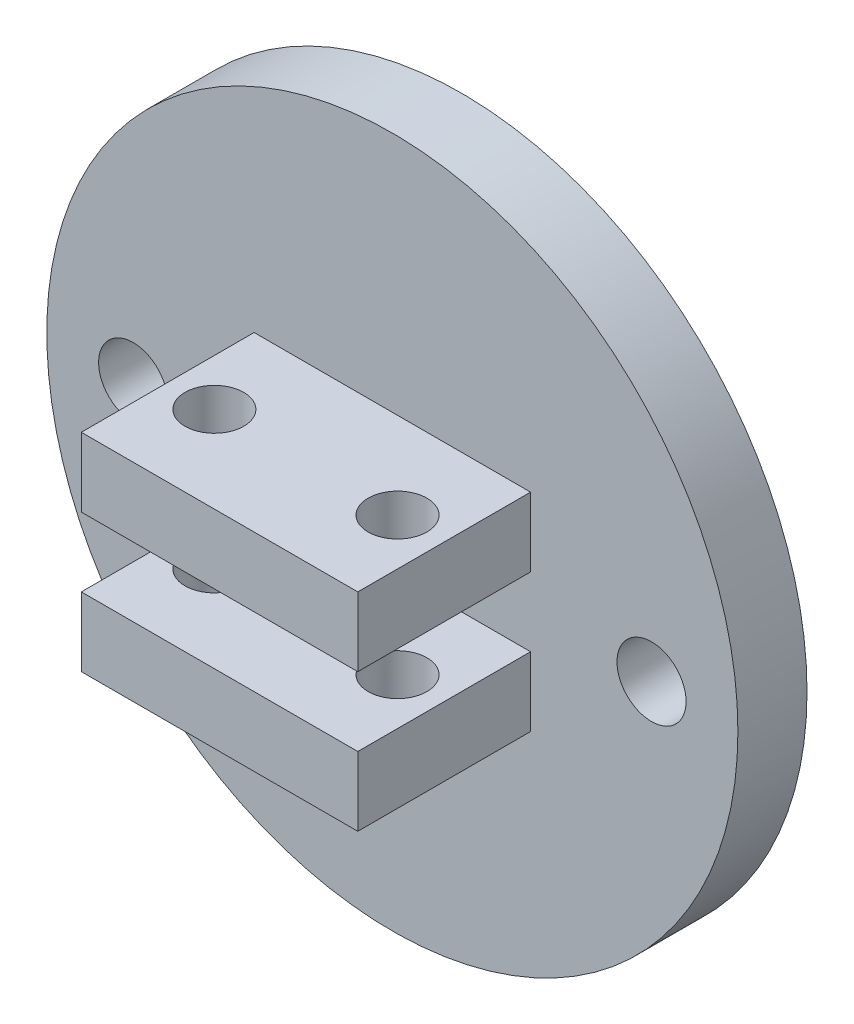
ISO-10303-21;
HEADER;
FILE_DESCRIPTION(('STEP AP214'),'2;1');
FILE_NAME('part.step','',(''),(''),'','','');
FILE_SCHEMA(('AUTOMOTIVE_DESIGN { 1 0 10303 214 1 1 1 1 }'));
ENDSEC;
DATA;
#1=APPLICATION_CONTEXT('core data for automotive mechanical design processes');
#2=APPLICATION_PROTOCOL_DEFINITION('international standard','automotive_design',2000,#1);
#3=PRODUCT_CONTEXT('',#1,'mechanical');
#4=PRODUCT('Part','Part','',(#3));
#5=PRODUCT_RELATED_PRODUCT_CATEGORY('part','',(#4));
#6=PRODUCT_DEFINITION_FORMATION('','',#4);
#7=PRODUCT_DEFINITION_CONTEXT('part definition',#1,'design');
#8=PRODUCT_DEFINITION('design','',#6,#7);
#9=PRODUCT_DEFINITION_SHAPE('','',#8);
#10=(LENGTH_UNIT() NAMED_UNIT(*) SI_UNIT(.MILLI.,.METRE.));
#11=(NAMED_UNIT(*) PLANE_ANGLE_UNIT() SI_UNIT($,.RADIAN.));
#12=(NAMED_UNIT(*) SI_UNIT($,.STERADIAN.) SOLID_ANGLE_UNIT());
#13=UNCERTAINTY_MEASURE_WITH_UNIT(LENGTH_MEASURE(1.E-05),#10,'distance_accuracy_value','');
#14=(GEOMETRIC_REPRESENTATION_CONTEXT(3) GLOBAL_UNCERTAINTY_ASSIGNED_CONTEXT((#13)) GLOBAL_UNIT_ASSIGNED_CONTEXT((#10,
#11,#12)) REPRESENTATION_CONTEXT('',''));
#15=CARTESIAN_POINT('',(0.,0.,0.));
#16=DIRECTION('',(0.,0.,1.));
#17=DIRECTION('',(1.,0.,0.));
#18=AXIS2_PLACEMENT_3D('',#15,#16,#17);
#19=CARTESIAN_POINT('',(0.,0.,2.));
#20=DIRECTION('',(0.,0.,1.));
#21=DIRECTION('',(1.,0.,0.));
#22=AXIS2_PLACEMENT_3D('',#19,#20,#21);
#23=PLANE('',#22);
#24=DIRECTION('',(0.,-1.,0.));
#25=VECTOR('',#24,1.);
#26=CARTESIAN_POINT('',(4.,0.,2.));
#27=LINE('',#26,#25);
#28=CARTESIAN_POINT('',(4.,-1.,2.));
#29=VERTEX_POINT('',#28);
#30=CARTESIAN_POINT('',(4.,-3.,2.));
#31=VERTEX_POINT('',#30);
#32=EDGE_CURVE('E113',#29,#31,#27,.T.);
#33=ORIENTED_EDGE('',*,*,#32,.T.);
#34=DIRECTION('',(1.,0.,0.));
#35=VECTOR('',#34,1.);
#36=CARTESIAN_POINT('',(0.,-3.,2.));
#37=LINE('',#36,#35);
#38=CARTESIAN_POINT('',(-4.,-3.,2.));
#39=VERTEX_POINT('',#38);
#40=EDGE_CURVE('E127',#39,#31,#37,.T.);
#41=ORIENTED_EDGE('',*,*,#40,.F.);
#42=DIRECTION('',(0.,-1.,0.));
#43=VECTOR('',#42,1.);
#44=CARTESIAN_POINT('',(-4.,0.,2.));
#45=LINE('',#44,#43);
#46=CARTESIAN_POINT('',(-4.,-1.,2.));
#47=VERTEX_POINT('',#46);
#48=EDGE_CURVE('E142',#47,#39,#45,.T.);
#49=ORIENTED_EDGE('',*,*,#48,.F.);
#50=DIRECTION('',(1.,0.,0.));
#51=VECTOR('',#50,1.);
#52=CARTESIAN_POINT('',(0.,-1.,2.));
#53=LINE('',#52,#51);
#54=EDGE_CURVE('E139',#47,#29,#53,.T.);
#55=ORIENTED_EDGE('',*,*,#54,.T.);
#56=EDGE_LOOP('',(#33,#41,#49,#55));
#57=FACE_BOUND('',#56,.T.);
#58=CARTESIAN_POINT('',(-7.5,0.,2.));
#59=DIRECTION('',(0.,0.,1.));
#60=DIRECTION('',(1.,0.,0.));
#61=AXIS2_PLACEMENT_3D('',#58,#59,#60);
#62=CIRCLE('',#61,1.);
#63=CARTESIAN_POINT('',(-6.5,0.,2.));
#64=VERTEX_POINT('',#63);
#65=EDGE_CURVE('E184',#64,#64,#62,.T.);
#66=ORIENTED_EDGE('',*,*,#65,.F.);
#67=EDGE_LOOP('',(#66));
#68=FACE_BOUND('',#67,.T.);
#69=CARTESIAN_POINT('',(0.,0.,2.));
#70=DIRECTION('',(0.,0.,1.));
#71=DIRECTION('',(1.,0.,0.));
#72=AXIS2_PLACEMENT_3D('',#69,#70,#71);
#73=CIRCLE('',#72,10.);
#74=CARTESIAN_POINT('',(10.,0.,2.));
#75=VERTEX_POINT('',#74);
#76=EDGE_CURVE('E11',#75,#75,#73,.T.);
#77=ORIENTED_EDGE('',*,*,#76,.T.);
#78=EDGE_LOOP('',(#77));
#79=FACE_BOUND('',#78,.T.);
#80=CARTESIAN_POINT('',(7.5,0.,2.));
#81=DIRECTION('',(0.,0.,1.));
#82=DIRECTION('',(1.,0.,0.));
#83=AXIS2_PLACEMENT_3D('',#80,#81,#82);
#84=CIRCLE('',#83,1.);
#85=CARTESIAN_POINT('',(8.5,0.,2.));
#86=VERTEX_POINT('',#85);
#87=EDGE_CURVE('E178',#86,#86,#84,.T.);
#88=ORIENTED_EDGE('',*,*,#87,.F.);
#89=EDGE_LOOP('',(#88));
#90=FACE_BOUND('',#89,.T.);
#91=DIRECTION('',(0.,1.,0.));
#92=VECTOR('',#91,1.);
#93=CARTESIAN_POINT('',(4.,0.,2.));
#94=LINE('',#93,#92);
#95=CARTESIAN_POINT('',(4.,1.,2.));
#96=VERTEX_POINT('',#95);
#97=CARTESIAN_POINT('',(4.,3.,2.));
#98=VERTEX_POINT('',#97);
#99=EDGE_CURVE('E64',#96,#98,#94,.T.);
#100=ORIENTED_EDGE('',*,*,#99,.F.);
#101=DIRECTION('',(1.,0.,0.));
#102=VECTOR('',#101,1.);
#103=CARTESIAN_POINT('',(0.,1.,2.));
#104=LINE('',#103,#102);
#105=CARTESIAN_POINT('',(-4.,1.,2.));
#106=VERTEX_POINT('',#105);
#107=EDGE_CURVE('E118',#106,#96,#104,.T.);
#108=ORIENTED_EDGE('',*,*,#107,.F.);
#109=DIRECTION('',(0.,1.,0.));
#110=VECTOR('',#109,1.);
#111=CARTESIAN_POINT('',(-4.,0.,2.));
#112=LINE('',#111,#110);
#113=CARTESIAN_POINT('',(-4.,3.,2.));
#114=VERTEX_POINT('',#113);
#115=EDGE_CURVE('E152',#106,#114,#112,.T.);
#116=ORIENTED_EDGE('',*,*,#115,.T.);
#117=DIRECTION('',(1.,0.,0.));
#118=VECTOR('',#117,1.);
#119=CARTESIAN_POINT('',(0.,3.,2.));
#120=LINE('',#119,#118);
#121=EDGE_CURVE('E164',#114,#98,#120,.T.);
#122=ORIENTED_EDGE('',*,*,#121,.T.);
#123=EDGE_LOOP('',(#100,#108,#116,#122));
#124=FACE_BOUND('',#123,.T.);
#125=ADVANCED_FACE('F39',(#57,#68,#79,#90,#124),#23,.T.);
#126=CARTESIAN_POINT('',(0.,0.,0.));
#127=DIRECTION('',(0.,0.,1.));
#128=DIRECTION('',(1.,0.,0.));
#129=AXIS2_PLACEMENT_3D('',#126,#127,#128);
#130=PLANE('',#129);
#131=CARTESIAN_POINT('',(0.,0.,0.));
#132=DIRECTION('',(0.,0.,1.));
#133=DIRECTION('',(1.,0.,0.));
#134=AXIS2_PLACEMENT_3D('',#131,#132,#133);
#135=CIRCLE('',#134,10.);
#136=CARTESIAN_POINT('',(10.,0.,0.));
#137=VERTEX_POINT('',#136);
#138=EDGE_CURVE('E48',#137,#137,#135,.T.);
#139=ORIENTED_EDGE('',*,*,#138,.F.);
#140=EDGE_LOOP('',(#139));
#141=FACE_BOUND('',#140,.T.);
#142=CARTESIAN_POINT('',(-7.5,0.,0.));
#143=DIRECTION('',(0.,0.,1.));
#144=DIRECTION('',(1.,0.,0.));
#145=AXIS2_PLACEMENT_3D('',#142,#143,#144);
#146=CIRCLE('',#145,1.);
#147=CARTESIAN_POINT('',(-6.5,0.,0.));
#148=VERTEX_POINT('',#147);
#149=EDGE_CURVE('E181',#148,#148,#146,.T.);
#150=ORIENTED_EDGE('',*,*,#149,.T.);
#151=EDGE_LOOP('',(#150));
#152=FACE_BOUND('',#151,.T.);
#153=CARTESIAN_POINT('',(7.5,0.,0.));
#154=DIRECTION('',(0.,0.,1.));
#155=DIRECTION('',(1.,0.,0.));
#156=AXIS2_PLACEMENT_3D('',#153,#154,#155);
#157=CIRCLE('',#156,1.);
#158=CARTESIAN_POINT('',(8.5,0.,0.));
#159=VERTEX_POINT('',#158);
#160=EDGE_CURVE('E177',#159,#159,#157,.T.);
#161=ORIENTED_EDGE('',*,*,#160,.T.);
#162=EDGE_LOOP('',(#161));
#163=FACE_BOUND('',#162,.T.);
#164=ADVANCED_FACE('F231',(#141,#152,#163),#130,.F.);
#165=CARTESIAN_POINT('',(0.,0.,2.));
#166=DIRECTION('',(0.,0.,-1.));
#167=DIRECTION('',(-1.,0.,0.));
#168=AXIS2_PLACEMENT_3D('',#165,#166,#167);
#169=CYLINDRICAL_SURFACE('',#168,10.);
#170=ORIENTED_EDGE('',*,*,#76,.F.);
#171=EDGE_LOOP('',(#170));
#172=FACE_BOUND('',#171,.T.);
#173=ORIENTED_EDGE('',*,*,#138,.T.);
#174=EDGE_LOOP('',(#173));
#175=FACE_BOUND('',#174,.T.);
#176=ADVANCED_FACE('F41',(#172,#175),#169,.T.);
#177=CARTESIAN_POINT('',(-7.5,0.,2.));
#178=DIRECTION('',(0.,0.,-1.));
#179=DIRECTION('',(-1.,0.,0.));
#180=AXIS2_PLACEMENT_3D('',#177,#178,#179);
#181=CYLINDRICAL_SURFACE('',#180,1.);
#182=ORIENTED_EDGE('',*,*,#65,.T.);
#183=EDGE_LOOP('',(#182));
#184=FACE_BOUND('',#183,.T.);
#185=ORIENTED_EDGE('',*,*,#149,.F.);
#186=EDGE_LOOP('',(#185));
#187=FACE_BOUND('',#186,.T.);
#188=ADVANCED_FACE('F242',(#184,#187),#181,.F.);
#189=CARTESIAN_POINT('',(7.5,0.,2.));
#190=DIRECTION('',(0.,0.,-1.));
#191=DIRECTION('',(-1.,0.,0.));
#192=AXIS2_PLACEMENT_3D('',#189,#190,#191);
#193=CYLINDRICAL_SURFACE('',#192,1.);
#194=ORIENTED_EDGE('',*,*,#87,.T.);
#195=EDGE_LOOP('',(#194));
#196=FACE_BOUND('',#195,.T.);
#197=ORIENTED_EDGE('',*,*,#160,.F.);
#198=EDGE_LOOP('',(#197));
#199=FACE_BOUND('',#198,.T.);
#200=ADVANCED_FACE('F245',(#196,#199),#193,.F.);
#201=CARTESIAN_POINT('',(0.,1.,7.));
#202=DIRECTION('',(0.,1.,0.));
#203=DIRECTION('',(0.,0.,1.));
#204=AXIS2_PLACEMENT_3D('',#201,#202,#203);
#205=PLANE('',#204);
#206=CARTESIAN_POINT('',(2.65,1.,4.5));
#207=DIRECTION('',(0.,1.,0.));
#208=DIRECTION('',(0.,0.,1.));
#209=AXIS2_PLACEMENT_3D('',#206,#207,#208);
#210=CIRCLE('',#209,0.849999999999993);
#211=CARTESIAN_POINT('',(2.65,1.,5.34999999999999));
#212=VERTEX_POINT('',#211);
#213=EDGE_CURVE('E204',#212,#212,#210,.T.);
#214=ORIENTED_EDGE('',*,*,#213,.T.);
#215=EDGE_LOOP('',(#214));
#216=FACE_BOUND('',#215,.T.);
#217=CARTESIAN_POINT('',(-2.65,1.,4.5));
#218=DIRECTION('',(0.,1.,0.));
#219=DIRECTION('',(0.,0.,1.));
#220=AXIS2_PLACEMENT_3D('',#217,#218,#219);
#221=CIRCLE('',#220,0.849999999999993);
#222=CARTESIAN_POINT('',(-2.65,1.,5.34999999999999));
#223=VERTEX_POINT('',#222);
#224=EDGE_CURVE('E140',#223,#223,#221,.T.);
#225=ORIENTED_EDGE('',*,*,#224,.T.);
#226=EDGE_LOOP('',(#225));
#227=FACE_BOUND('',#226,.T.);
#228=ORIENTED_EDGE('',*,*,#107,.T.);
#229=DIRECTION('',(0.,0.,-1.));
#230=VECTOR('',#229,1.);
#231=CARTESIAN_POINT('',(4.,1.,7.));
#232=LINE('',#231,#230);
#233=CARTESIAN_POINT('',(4.,1.,7.));
#234=VERTEX_POINT('',#233);
#235=EDGE_CURVE('E175',#234,#96,#232,.T.);
#236=ORIENTED_EDGE('',*,*,#235,.F.);
#237=DIRECTION('',(1.,0.,0.));
#238=VECTOR('',#237,1.);
#239=CARTESIAN_POINT('',(0.,1.,7.));
#240=LINE('',#239,#238);
#241=CARTESIAN_POINT('',(-4.,1.,7.));
#242=VERTEX_POINT('',#241);
#243=EDGE_CURVE('E148',#242,#234,#240,.T.);
#244=ORIENTED_EDGE('',*,*,#243,.F.);
#245=DIRECTION('',(0.,0.,-1.));
#246=VECTOR('',#245,1.);
#247=CARTESIAN_POINT('',(-4.,1.,7.));
#248=LINE('',#247,#246);
#249=EDGE_CURVE('E160',#242,#106,#248,.T.);
#250=ORIENTED_EDGE('',*,*,#249,.T.);
#251=EDGE_LOOP('',(#228,#236,#244,#250));
#252=FACE_BOUND('',#251,.T.);
#253=ADVANCED_FACE('F210',(#216,#227,#252),#205,.F.);
#254=CARTESIAN_POINT('',(4.,0.,7.));
#255=DIRECTION('',(-1.,0.,0.));
#256=DIRECTION('',(0.,0.,1.));
#257=AXIS2_PLACEMENT_3D('',#254,#255,#256);
#258=PLANE('',#257);
#259=ORIENTED_EDGE('',*,*,#99,.T.);
#260=DIRECTION('',(0.,0.,-1.));
#261=VECTOR('',#260,1.);
#262=CARTESIAN_POINT('',(4.,3.,7.));
#263=LINE('',#262,#261);
#264=CARTESIAN_POINT('',(4.,3.,7.));
#265=VERTEX_POINT('',#264);
#266=EDGE_CURVE('E172',#265,#98,#263,.T.);
#267=ORIENTED_EDGE('',*,*,#266,.F.);
#268=DIRECTION('',(0.,1.,0.));
#269=VECTOR('',#268,1.);
#270=CARTESIAN_POINT('',(4.,0.,7.));
#271=LINE('',#270,#269);
#272=EDGE_CURVE('E151',#234,#265,#271,.T.);
#273=ORIENTED_EDGE('',*,*,#272,.F.);
#274=ORIENTED_EDGE('',*,*,#235,.T.);
#275=EDGE_LOOP('',(#259,#267,#273,#274));
#276=FACE_BOUND('',#275,.T.);
#277=ADVANCED_FACE('F251',(#276),#258,.F.);
#278=CARTESIAN_POINT('',(0.,3.,7.));
#279=DIRECTION('',(0.,1.,0.));
#280=DIRECTION('',(0.,0.,1.));
#281=AXIS2_PLACEMENT_3D('',#278,#279,#280);
#282=PLANE('',#281);
#283=CARTESIAN_POINT('',(2.65,3.,4.5));
#284=DIRECTION('',(0.,1.,0.));
#285=DIRECTION('',(0.,0.,1.));
#286=AXIS2_PLACEMENT_3D('',#283,#284,#285);
#287=CIRCLE('',#286,0.849999999999993);
#288=CARTESIAN_POINT('',(2.65,3.,5.34999999999999));
#289=VERTEX_POINT('',#288);
#290=EDGE_CURVE('E304',#289,#289,#287,.T.);
#291=ORIENTED_EDGE('',*,*,#290,.F.);
#292=EDGE_LOOP('',(#291));
#293=FACE_BOUND('',#292,.T.);
#294=CARTESIAN_POINT('',(-2.65,3.,4.5));
#295=DIRECTION('',(0.,1.,0.));
#296=DIRECTION('',(0.,0.,1.));
#297=AXIS2_PLACEMENT_3D('',#294,#295,#296);
#298=CIRCLE('',#297,0.849999999999993);
#299=CARTESIAN_POINT('',(-2.65,3.,5.34999999999999));
#300=VERTEX_POINT('',#299);
#301=EDGE_CURVE('E190',#300,#300,#298,.T.);
#302=ORIENTED_EDGE('',*,*,#301,.F.);
#303=EDGE_LOOP('',(#302));
#304=FACE_BOUND('',#303,.T.);
#305=ORIENTED_EDGE('',*,*,#121,.F.);
#306=DIRECTION('',(0.,0.,-1.));
#307=VECTOR('',#306,1.);
#308=CARTESIAN_POINT('',(-4.,3.,7.));
#309=LINE('',#308,#307);
#310=CARTESIAN_POINT('',(-4.,3.,7.));
#311=VERTEX_POINT('',#310);
#312=EDGE_CURVE('E169',#311,#114,#309,.T.);
#313=ORIENTED_EDGE('',*,*,#312,.F.);
#314=DIRECTION('',(1.,0.,0.));
#315=VECTOR('',#314,1.);
#316=CARTESIAN_POINT('',(0.,3.,7.));
#317=LINE('',#316,#315);
#318=EDGE_CURVE('E154',#311,#265,#317,.T.);
#319=ORIENTED_EDGE('',*,*,#318,.T.);
#320=ORIENTED_EDGE('',*,*,#266,.T.);
#321=EDGE_LOOP('',(#305,#313,#319,#320));
#322=FACE_BOUND('',#321,.T.);
#323=ADVANCED_FACE('F254',(#293,#304,#322),#282,.T.);
#324=CARTESIAN_POINT('',(-4.,0.,7.));
#325=DIRECTION('',(-1.,0.,0.));
#326=DIRECTION('',(0.,-1.,0.));
#327=AXIS2_PLACEMENT_3D('',#324,#325,#326);
#328=PLANE('',#327);
#329=ORIENTED_EDGE('',*,*,#115,.F.);
#330=ORIENTED_EDGE('',*,*,#249,.F.);
#331=DIRECTION('',(0.,1.,0.));
#332=VECTOR('',#331,1.);
#333=CARTESIAN_POINT('',(-4.,0.,7.));
#334=LINE('',#333,#332);
#335=EDGE_CURVE('E157',#242,#311,#334,.T.);
#336=ORIENTED_EDGE('',*,*,#335,.T.);
#337=ORIENTED_EDGE('',*,*,#312,.T.);
#338=EDGE_LOOP('',(#329,#330,#336,#337));
#339=FACE_BOUND('',#338,.T.);
#340=ADVANCED_FACE('F258',(#339),#328,.T.);
#341=CARTESIAN_POINT('',(0.,0.,7.));
#342=DIRECTION('',(0.,0.,1.));
#343=DIRECTION('',(1.,0.,0.));
#344=AXIS2_PLACEMENT_3D('',#341,#342,#343);
#345=PLANE('',#344);
#346=ORIENTED_EDGE('',*,*,#243,.T.);
#347=ORIENTED_EDGE('',*,*,#272,.T.);
#348=ORIENTED_EDGE('',*,*,#318,.F.);
#349=ORIENTED_EDGE('',*,*,#335,.F.);
#350=EDGE_LOOP('',(#346,#347,#348,#349));
#351=FACE_BOUND('',#350,.T.);
#352=ADVANCED_FACE('F262',(#351),#345,.T.);
#353=CARTESIAN_POINT('',(4.,0.,7.));
#354=DIRECTION('',(1.,0.,0.));
#355=DIRECTION('',(0.,1.,0.));
#356=AXIS2_PLACEMENT_3D('',#353,#354,#355);
#357=PLANE('',#356);
#358=ORIENTED_EDGE('',*,*,#32,.F.);
#359=DIRECTION('',(0.,0.,-1.));
#360=VECTOR('',#359,1.);
#361=CARTESIAN_POINT('',(4.,-1.,7.));
#362=LINE('',#361,#360);
#363=CARTESIAN_POINT('',(4.,-1.,7.));
#364=VERTEX_POINT('',#363);
#365=EDGE_CURVE('E108',#364,#29,#362,.T.);
#366=ORIENTED_EDGE('',*,*,#365,.F.);
#367=DIRECTION('',(0.,-1.,0.));
#368=VECTOR('',#367,1.);
#369=CARTESIAN_POINT('',(4.,0.,7.));
#370=LINE('',#369,#368);
#371=CARTESIAN_POINT('',(4.,-3.,7.));
#372=VERTEX_POINT('',#371);
#373=EDGE_CURVE('E111',#364,#372,#370,.T.);
#374=ORIENTED_EDGE('',*,*,#373,.T.);
#375=DIRECTION('',(0.,0.,-1.));
#376=VECTOR('',#375,1.);
#377=CARTESIAN_POINT('',(4.,-3.,7.));
#378=LINE('',#377,#376);
#379=EDGE_CURVE('E137',#372,#31,#378,.T.);
#380=ORIENTED_EDGE('',*,*,#379,.T.);
#381=EDGE_LOOP('',(#358,#366,#374,#380));
#382=FACE_BOUND('',#381,.T.);
#383=ADVANCED_FACE('F110',(#382),#357,.T.);
#384=CARTESIAN_POINT('',(0.,-1.,7.));
#385=DIRECTION('',(0.,1.,0.));
#386=DIRECTION('',(0.,0.,1.));
#387=AXIS2_PLACEMENT_3D('',#384,#385,#386);
#388=PLANE('',#387);
#389=CARTESIAN_POINT('',(2.65,-1.,4.5));
#390=DIRECTION('',(0.,1.,0.));
#391=DIRECTION('',(0.,0.,1.));
#392=AXIS2_PLACEMENT_3D('',#389,#390,#391);
#393=CIRCLE('',#392,0.849999999999993);
#394=CARTESIAN_POINT('',(2.65,-1.,5.34999999999999));
#395=VERTEX_POINT('',#394);
#396=EDGE_CURVE('E43',#395,#395,#393,.T.);
#397=ORIENTED_EDGE('',*,*,#396,.F.);
#398=EDGE_LOOP('',(#397));
#399=FACE_BOUND('',#398,.T.);
#400=CARTESIAN_POINT('',(-2.65,-1.,4.5));
#401=DIRECTION('',(0.,1.,0.));
#402=DIRECTION('',(0.,0.,1.));
#403=AXIS2_PLACEMENT_3D('',#400,#401,#402);
#404=CIRCLE('',#403,0.849999999999993);
#405=CARTESIAN_POINT('',(-2.65,-1.,5.34999999999999));
#406=VERTEX_POINT('',#405);
#407=EDGE_CURVE('E192',#406,#406,#404,.T.);
#408=ORIENTED_EDGE('',*,*,#407,.F.);
#409=EDGE_LOOP('',(#408));
#410=FACE_BOUND('',#409,.T.);
#411=ORIENTED_EDGE('',*,*,#54,.F.);
#412=DIRECTION('',(0.,0.,-1.));
#413=VECTOR('',#412,1.);
#414=CARTESIAN_POINT('',(-4.,-1.,7.));
#415=LINE('',#414,#413);
#416=CARTESIAN_POINT('',(-4.,-1.,7.));
#417=VERTEX_POINT('',#416);
#418=EDGE_CURVE('E119',#417,#47,#415,.T.);
#419=ORIENTED_EDGE('',*,*,#418,.F.);
#420=DIRECTION('',(1.,0.,0.));
#421=VECTOR('',#420,1.);
#422=CARTESIAN_POINT('',(0.,-1.,7.));
#423=LINE('',#422,#421);
#424=EDGE_CURVE('E124',#417,#364,#423,.T.);
#425=ORIENTED_EDGE('',*,*,#424,.T.);
#426=ORIENTED_EDGE('',*,*,#365,.T.);
#427=EDGE_LOOP('',(#411,#419,#425,#426));
#428=FACE_BOUND('',#427,.T.);
#429=ADVANCED_FACE('F129',(#399,#410,#428),#388,.T.);
#430=CARTESIAN_POINT('',(-4.,0.,7.));
#431=DIRECTION('',(1.,0.,0.));
#432=DIRECTION('',(0.,1.,0.));
#433=AXIS2_PLACEMENT_3D('',#430,#431,#432);
#434=PLANE('',#433);
#435=ORIENTED_EDGE('',*,*,#48,.T.);
#436=DIRECTION('',(0.,0.,-1.));
#437=VECTOR('',#436,1.);
#438=CARTESIAN_POINT('',(-4.,-3.,7.));
#439=LINE('',#438,#437);
#440=CARTESIAN_POINT('',(-4.,-3.,7.));
#441=VERTEX_POINT('',#440);
#442=EDGE_CURVE('E56',#441,#39,#439,.T.);
#443=ORIENTED_EDGE('',*,*,#442,.F.);
#444=DIRECTION('',(0.,-1.,0.));
#445=VECTOR('',#444,1.);
#446=CARTESIAN_POINT('',(-4.,0.,7.));
#447=LINE('',#446,#445);
#448=EDGE_CURVE('E131',#417,#441,#447,.T.);
#449=ORIENTED_EDGE('',*,*,#448,.F.);
#450=ORIENTED_EDGE('',*,*,#418,.T.);
#451=EDGE_LOOP('',(#435,#443,#449,#450));
#452=FACE_BOUND('',#451,.T.);
#453=ADVANCED_FACE('F271',(#452),#434,.F.);
#454=CARTESIAN_POINT('',(0.,-3.,7.));
#455=DIRECTION('',(0.,1.,0.));
#456=DIRECTION('',(0.,0.,1.));
#457=AXIS2_PLACEMENT_3D('',#454,#455,#456);
#458=PLANE('',#457);
#459=CARTESIAN_POINT('',(2.65,-3.,4.5));
#460=DIRECTION('',(0.,-1.,0.));
#461=DIRECTION('',(0.,0.,-1.));
#462=AXIS2_PLACEMENT_3D('',#459,#460,#461);
#463=CIRCLE('',#462,0.875000000000001);
#464=CARTESIAN_POINT('',(2.65,-3.,3.625));
#465=VERTEX_POINT('',#464);
#466=EDGE_CURVE('E300',#465,#465,#463,.T.);
#467=ORIENTED_EDGE('',*,*,#466,.F.);
#468=EDGE_LOOP('',(#467));
#469=FACE_BOUND('',#468,.T.);
#470=CARTESIAN_POINT('',(-2.65,-3.,4.5));
#471=DIRECTION('',(0.,-1.,0.));
#472=DIRECTION('',(0.,0.,-1.));
#473=AXIS2_PLACEMENT_3D('',#470,#471,#472);
#474=CIRCLE('',#473,0.875000000000001);
#475=CARTESIAN_POINT('',(-2.65,-3.,3.625));
#476=VERTEX_POINT('',#475);
#477=EDGE_CURVE('E199',#476,#476,#474,.T.);
#478=ORIENTED_EDGE('',*,*,#477,.F.);
#479=EDGE_LOOP('',(#478));
#480=FACE_BOUND('',#479,.T.);
#481=ORIENTED_EDGE('',*,*,#40,.T.);
#482=ORIENTED_EDGE('',*,*,#379,.F.);
#483=DIRECTION('',(1.,0.,0.));
#484=VECTOR('',#483,1.);
#485=CARTESIAN_POINT('',(0.,-3.,7.));
#486=LINE('',#485,#484);
#487=EDGE_CURVE('E125',#441,#372,#486,.T.);
#488=ORIENTED_EDGE('',*,*,#487,.F.);
#489=ORIENTED_EDGE('',*,*,#442,.T.);
#490=EDGE_LOOP('',(#481,#482,#488,#489));
#491=FACE_BOUND('',#490,.T.);
#492=ADVANCED_FACE('F275',(#469,#480,#491),#458,.F.);
#493=CARTESIAN_POINT('',(0.,0.,7.));
#494=DIRECTION('',(0.,0.,1.));
#495=DIRECTION('',(1.,0.,0.));
#496=AXIS2_PLACEMENT_3D('',#493,#494,#495);
#497=PLANE('',#496);
#498=ORIENTED_EDGE('',*,*,#373,.F.);
#499=ORIENTED_EDGE('',*,*,#424,.F.);
#500=ORIENTED_EDGE('',*,*,#448,.T.);
#501=ORIENTED_EDGE('',*,*,#487,.T.);
#502=EDGE_LOOP('',(#498,#499,#500,#501));
#503=FACE_BOUND('',#502,.T.);
#504=ADVANCED_FACE('F123',(#503),#497,.T.);
#505=CARTESIAN_POINT('',(-2.65,-3.,4.5));
#506=DIRECTION('',(0.,-1.,0.));
#507=DIRECTION('',(0.,0.,-1.));
#508=AXIS2_PLACEMENT_3D('',#505,#506,#507);
#509=CONICAL_SURFACE('',#508,0.875000000000001,0.715584993317597);
#510=CARTESIAN_POINT('',(-2.65,-2.97124078981946,4.5));
#511=DIRECTION('',(0.,-1.,0.));
#512=DIRECTION('',(0.,0.,-1.));
#513=AXIS2_PLACEMENT_3D('',#510,#511,#512);
#514=CIRCLE('',#513,0.849999999999988);
#515=CARTESIAN_POINT('',(-2.65,-2.97124078981946,3.65000000000001));
#516=VERTEX_POINT('',#515);
#517=EDGE_CURVE('E193',#516,#516,#514,.T.);
#518=ORIENTED_EDGE('',*,*,#517,.F.);
#519=EDGE_LOOP('',(#518));
#520=FACE_BOUND('',#519,.T.);
#521=ORIENTED_EDGE('',*,*,#477,.T.);
#522=EDGE_LOOP('',(#521));
#523=FACE_BOUND('',#522,.T.);
#524=ADVANCED_FACE('F226',(#520,#523),#509,.F.);
#525=CARTESIAN_POINT('',(-2.65,-3.,4.5));
#526=DIRECTION('',(0.,-1.,0.));
#527=DIRECTION('',(0.,0.,-1.));
#528=AXIS2_PLACEMENT_3D('',#525,#526,#527);
#529=CYLINDRICAL_SURFACE('',#528,0.849999999999993);
#530=ORIENTED_EDGE('',*,*,#407,.T.);
#531=EDGE_LOOP('',(#530));
#532=FACE_BOUND('',#531,.T.);
#533=ORIENTED_EDGE('',*,*,#517,.T.);
#534=EDGE_LOOP('',(#533));
#535=FACE_BOUND('',#534,.T.);
#536=ADVANCED_FACE('F216',(#532,#535),#529,.F.);
#537=ORIENTED_EDGE('',*,*,#301,.T.);
#538=EDGE_LOOP('',(#537));
#539=FACE_BOUND('',#538,.T.);
#540=ORIENTED_EDGE('',*,*,#224,.F.);
#541=EDGE_LOOP('',(#540));
#542=FACE_BOUND('',#541,.T.);
#543=ADVANCED_FACE('F213',(#539,#542),#529,.F.);
#544=CARTESIAN_POINT('',(2.65,-3.,4.5));
#545=DIRECTION('',(0.,-1.,0.));
#546=DIRECTION('',(0.,0.,-1.));
#547=AXIS2_PLACEMENT_3D('',#544,#545,#546);
#548=CYLINDRICAL_SURFACE('',#547,0.849999999999993);
#549=ORIENTED_EDGE('',*,*,#396,.T.);
#550=EDGE_LOOP('',(#549));
#551=FACE_BOUND('',#550,.T.);
#552=CARTESIAN_POINT('',(2.65,-2.97124078981946,4.5));
#553=DIRECTION('',(0.,-1.,0.));
#554=DIRECTION('',(0.,0.,-1.));
#555=AXIS2_PLACEMENT_3D('',#552,#553,#554);
#556=CIRCLE('',#555,0.849999999999988);
#557=CARTESIAN_POINT('',(2.65,-2.97124078981946,3.65000000000001));
#558=VERTEX_POINT('',#557);
#559=EDGE_CURVE('E297',#558,#558,#556,.T.);
#560=ORIENTED_EDGE('',*,*,#559,.T.);
#561=EDGE_LOOP('',(#560));
#562=FACE_BOUND('',#561,.T.);
#563=ADVANCED_FACE('F215',(#551,#562),#548,.F.);
#564=CARTESIAN_POINT('',(2.65,-3.,4.5));
#565=DIRECTION('',(0.,-1.,0.));
#566=DIRECTION('',(0.,0.,-1.));
#567=AXIS2_PLACEMENT_3D('',#564,#565,#566);
#568=CONICAL_SURFACE('',#567,0.875000000000001,0.715584993317597);
#569=ORIENTED_EDGE('',*,*,#559,.F.);
#570=EDGE_LOOP('',(#569));
#571=FACE_BOUND('',#570,.T.);
#572=ORIENTED_EDGE('',*,*,#466,.T.);
#573=EDGE_LOOP('',(#572));
#574=FACE_BOUND('',#573,.T.);
#575=ADVANCED_FACE('F222',(#571,#574),#568,.F.);
#576=ORIENTED_EDGE('',*,*,#290,.T.);
#577=EDGE_LOOP('',(#576));
#578=FACE_BOUND('',#577,.T.);
#579=ORIENTED_EDGE('',*,*,#213,.F.);
#580=EDGE_LOOP('',(#579));
#581=FACE_BOUND('',#580,.T.);
#582=ADVANCED_FACE('F225',(#578,#581),#548,.F.);
#583=CLOSED_SHELL('',(#125,#164,#176,#188,#200,#253,#277,#323,#340,#352,#383,#429,#453,#492,
#504,#524,#536,#543,#563,#575,#582));
#584=MANIFOLD_SOLID_BREP('B2',#583);
#585=ADVANCED_BREP_SHAPE_REPRESENTATION('',(#18,#584),#14);
#586=SHAPE_DEFINITION_REPRESENTATION(#9,#585);
ENDSEC;
END-ISO-10303-21;
